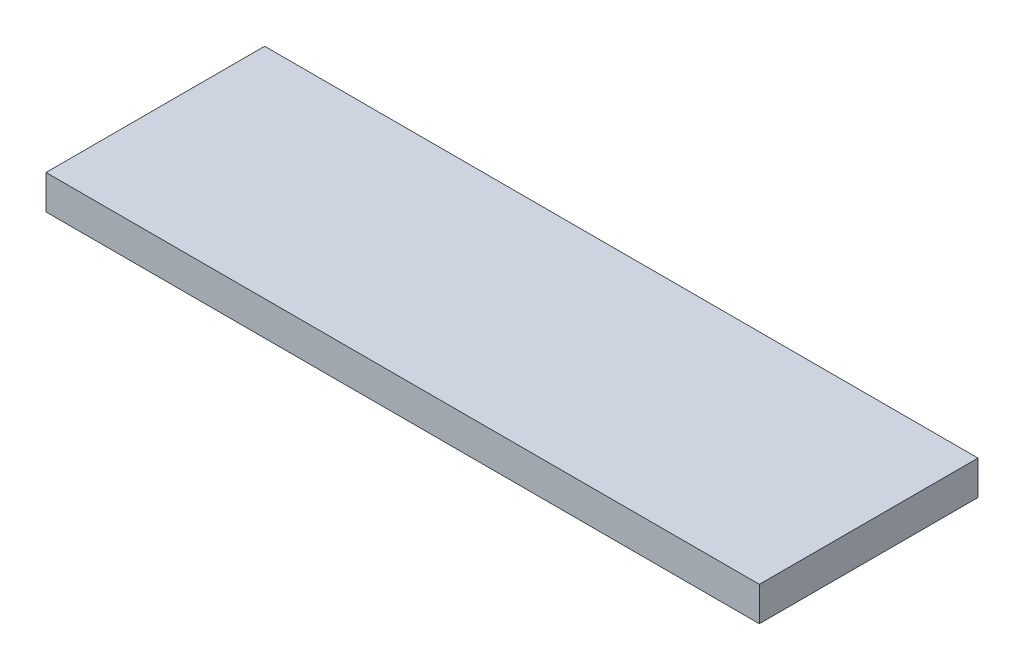
ISO-10303-21;
HEADER;
FILE_DESCRIPTION(('STEP AP214'),'2;1');
FILE_NAME('part.step','',(''),(''),'','','');
FILE_SCHEMA(('AUTOMOTIVE_DESIGN { 1 0 10303 214 1 1 1 1 }'));
ENDSEC;
DATA;
#1=APPLICATION_CONTEXT('core data for automotive mechanical design processes');
#2=APPLICATION_PROTOCOL_DEFINITION('international standard','automotive_design',2000,#1);
#3=PRODUCT_CONTEXT('',#1,'mechanical');
#4=PRODUCT('Part','Part','',(#3));
#5=PRODUCT_RELATED_PRODUCT_CATEGORY('part','',(#4));
#6=PRODUCT_DEFINITION_FORMATION('','',#4);
#7=PRODUCT_DEFINITION_CONTEXT('part definition',#1,'design');
#8=PRODUCT_DEFINITION('design','',#6,#7);
#9=PRODUCT_DEFINITION_SHAPE('','',#8);
#10=(LENGTH_UNIT() NAMED_UNIT(*) SI_UNIT(.MILLI.,.METRE.));
#11=(NAMED_UNIT(*) PLANE_ANGLE_UNIT() SI_UNIT($,.RADIAN.));
#12=(NAMED_UNIT(*) SI_UNIT($,.STERADIAN.) SOLID_ANGLE_UNIT());
#13=UNCERTAINTY_MEASURE_WITH_UNIT(LENGTH_MEASURE(1.E-05),#10,'distance_accuracy_value','');
#14=(GEOMETRIC_REPRESENTATION_CONTEXT(3) GLOBAL_UNCERTAINTY_ASSIGNED_CONTEXT((#13)) GLOBAL_UNIT_ASSIGNED_CONTEXT((#10,
#11,#12)) REPRESENTATION_CONTEXT('',''));
#15=CARTESIAN_POINT('',(0.,0.,0.));
#16=DIRECTION('',(0.,0.,1.));
#17=DIRECTION('',(1.,0.,0.));
#18=AXIS2_PLACEMENT_3D('',#15,#16,#17);
#19=CARTESIAN_POINT('',(0.,6.35,0.));
#20=DIRECTION('',(1.,0.,0.));
#21=DIRECTION('',(0.,0.,-1.));
#22=AXIS2_PLACEMENT_3D('',#19,#20,#21);
#23=PLANE('',#22);
#24=DIRECTION('',(0.,0.,1.));
#25=VECTOR('',#24,1.);
#26=CARTESIAN_POINT('',(0.,0.,0.));
#27=LINE('',#26,#25);
#28=CARTESIAN_POINT('',(0.,0.,-40.64));
#29=VERTEX_POINT('',#28);
#30=CARTESIAN_POINT('',(0.,0.,0.));
#31=VERTEX_POINT('',#30);
#32=EDGE_CURVE('E113',#29,#31,#27,.T.);
#33=ORIENTED_EDGE('',*,*,#32,.T.);
#34=DIRECTION('',(0.,-1.,0.));
#35=VECTOR('',#34,1.);
#36=CARTESIAN_POINT('',(0.,6.35,0.));
#37=LINE('',#36,#35);
#38=CARTESIAN_POINT('',(0.,6.35,0.));
#39=VERTEX_POINT('',#38);
#40=EDGE_CURVE('E11',#39,#31,#37,.T.);
#41=ORIENTED_EDGE('',*,*,#40,.F.);
#42=DIRECTION('',(0.,0.,1.));
#43=VECTOR('',#42,1.);
#44=CARTESIAN_POINT('',(0.,6.35,0.));
#45=LINE('',#44,#43);
#46=CARTESIAN_POINT('',(0.,6.35,-40.64));
#47=VERTEX_POINT('',#46);
#48=EDGE_CURVE('E97',#47,#39,#45,.T.);
#49=ORIENTED_EDGE('',*,*,#48,.F.);
#50=DIRECTION('',(0.,-1.,0.));
#51=VECTOR('',#50,1.);
#52=CARTESIAN_POINT('',(0.,6.35,-40.64));
#53=LINE('',#52,#51);
#54=EDGE_CURVE('E109',#47,#29,#53,.T.);
#55=ORIENTED_EDGE('',*,*,#54,.T.);
#56=EDGE_LOOP('',(#33,#41,#49,#55));
#57=FACE_BOUND('',#56,.T.);
#58=ADVANCED_FACE('F45',(#57),#23,.F.);
#59=CARTESIAN_POINT('',(0.,6.35,0.));
#60=DIRECTION('',(0.,0.,-1.));
#61=DIRECTION('',(-1.,0.,0.));
#62=AXIS2_PLACEMENT_3D('',#59,#60,#61);
#63=PLANE('',#62);
#64=DIRECTION('',(1.,0.,0.));
#65=VECTOR('',#64,1.);
#66=CARTESIAN_POINT('',(0.,0.,0.));
#67=LINE('',#66,#65);
#68=CARTESIAN_POINT('',(132.588,0.,0.));
#69=VERTEX_POINT('',#68);
#70=EDGE_CURVE('E102',#31,#69,#67,.T.);
#71=ORIENTED_EDGE('',*,*,#70,.T.);
#72=DIRECTION('',(0.,-1.,0.));
#73=VECTOR('',#72,1.);
#74=CARTESIAN_POINT('',(132.588,6.35,0.));
#75=LINE('',#74,#73);
#76=CARTESIAN_POINT('',(132.588,6.35,0.));
#77=VERTEX_POINT('',#76);
#78=EDGE_CURVE('E54',#77,#69,#75,.T.);
#79=ORIENTED_EDGE('',*,*,#78,.F.);
#80=DIRECTION('',(1.,0.,0.));
#81=VECTOR('',#80,1.);
#82=CARTESIAN_POINT('',(0.,6.35,0.));
#83=LINE('',#82,#81);
#84=EDGE_CURVE('E92',#39,#77,#83,.T.);
#85=ORIENTED_EDGE('',*,*,#84,.F.);
#86=ORIENTED_EDGE('',*,*,#40,.T.);
#87=EDGE_LOOP('',(#71,#79,#85,#86));
#88=FACE_BOUND('',#87,.T.);
#89=ADVANCED_FACE('F101',(#88),#63,.F.);
#90=CARTESIAN_POINT('',(132.588,6.35,0.));
#91=DIRECTION('',(-1.,0.,0.));
#92=DIRECTION('',(0.,0.,1.));
#93=AXIS2_PLACEMENT_3D('',#90,#91,#92);
#94=PLANE('',#93);
#95=DIRECTION('',(0.,0.,-1.));
#96=VECTOR('',#95,1.);
#97=CARTESIAN_POINT('',(132.588,0.,0.));
#98=LINE('',#97,#96);
#99=CARTESIAN_POINT('',(132.588,0.,-40.64));
#100=VERTEX_POINT('',#99);
#101=EDGE_CURVE('E79',#69,#100,#98,.T.);
#102=ORIENTED_EDGE('',*,*,#101,.T.);
#103=DIRECTION('',(0.,-1.,0.));
#104=VECTOR('',#103,1.);
#105=CARTESIAN_POINT('',(132.588,6.35,-40.64));
#106=LINE('',#105,#104);
#107=CARTESIAN_POINT('',(132.588,6.35,-40.64));
#108=VERTEX_POINT('',#107);
#109=EDGE_CURVE('E104',#108,#100,#106,.T.);
#110=ORIENTED_EDGE('',*,*,#109,.F.);
#111=DIRECTION('',(0.,0.,-1.));
#112=VECTOR('',#111,1.);
#113=CARTESIAN_POINT('',(132.588,6.35,0.));
#114=LINE('',#113,#112);
#115=EDGE_CURVE('E95',#77,#108,#114,.T.);
#116=ORIENTED_EDGE('',*,*,#115,.F.);
#117=ORIENTED_EDGE('',*,*,#78,.T.);
#118=EDGE_LOOP('',(#102,#110,#116,#117));
#119=FACE_BOUND('',#118,.T.);
#120=ADVANCED_FACE('F105',(#119),#94,.F.);
#121=CARTESIAN_POINT('',(0.,6.35,-40.64));
#122=DIRECTION('',(0.,0.,1.));
#123=DIRECTION('',(1.,0.,0.));
#124=AXIS2_PLACEMENT_3D('',#121,#122,#123);
#125=PLANE('',#124);
#126=DIRECTION('',(-1.,0.,0.));
#127=VECTOR('',#126,1.);
#128=CARTESIAN_POINT('',(0.,0.,-40.64));
#129=LINE('',#128,#127);
#130=EDGE_CURVE('E85',#100,#29,#129,.T.);
#131=ORIENTED_EDGE('',*,*,#130,.T.);
#132=ORIENTED_EDGE('',*,*,#54,.F.);
#133=DIRECTION('',(-1.,0.,0.));
#134=VECTOR('',#133,1.);
#135=CARTESIAN_POINT('',(0.,6.35,-40.64));
#136=LINE('',#135,#134);
#137=EDGE_CURVE('E62',#108,#47,#136,.T.);
#138=ORIENTED_EDGE('',*,*,#137,.F.);
#139=ORIENTED_EDGE('',*,*,#109,.T.);
#140=EDGE_LOOP('',(#131,#132,#138,#139));
#141=FACE_BOUND('',#140,.T.);
#142=ADVANCED_FACE('F126',(#141),#125,.F.);
#143=CARTESIAN_POINT('',(0.,6.35,0.));
#144=DIRECTION('',(0.,-1.,0.));
#145=DIRECTION('',(0.,0.,-1.));
#146=AXIS2_PLACEMENT_3D('',#143,#144,#145);
#147=PLANE('',#146);
#148=ORIENTED_EDGE('',*,*,#48,.T.);
#149=ORIENTED_EDGE('',*,*,#84,.T.);
#150=ORIENTED_EDGE('',*,*,#115,.T.);
#151=ORIENTED_EDGE('',*,*,#137,.T.);
#152=EDGE_LOOP('',(#148,#149,#150,#151));
#153=FACE_BOUND('',#152,.T.);
#154=ADVANCED_FACE('F93',(#153),#147,.F.);
#155=CARTESIAN_POINT('',(0.,0.,0.));
#156=DIRECTION('',(0.,-1.,0.));
#157=DIRECTION('',(0.,0.,-1.));
#158=AXIS2_PLACEMENT_3D('',#155,#156,#157);
#159=PLANE('',#158);
#160=ORIENTED_EDGE('',*,*,#32,.F.);
#161=ORIENTED_EDGE('',*,*,#130,.F.);
#162=ORIENTED_EDGE('',*,*,#101,.F.);
#163=ORIENTED_EDGE('',*,*,#70,.F.);
#164=EDGE_LOOP('',(#160,#161,#162,#163));
#165=FACE_BOUND('',#164,.T.);
#166=ADVANCED_FACE('F129',(#165),#159,.T.);
#167=CLOSED_SHELL('',(#58,#89,#120,#142,#154,#166));
#168=MANIFOLD_SOLID_BREP('B2',#167);
#169=ADVANCED_BREP_SHAPE_REPRESENTATION('',(#18,#168),#14);
#170=SHAPE_DEFINITION_REPRESENTATION(#9,#169);
ENDSEC;
END-ISO-10303-21;
